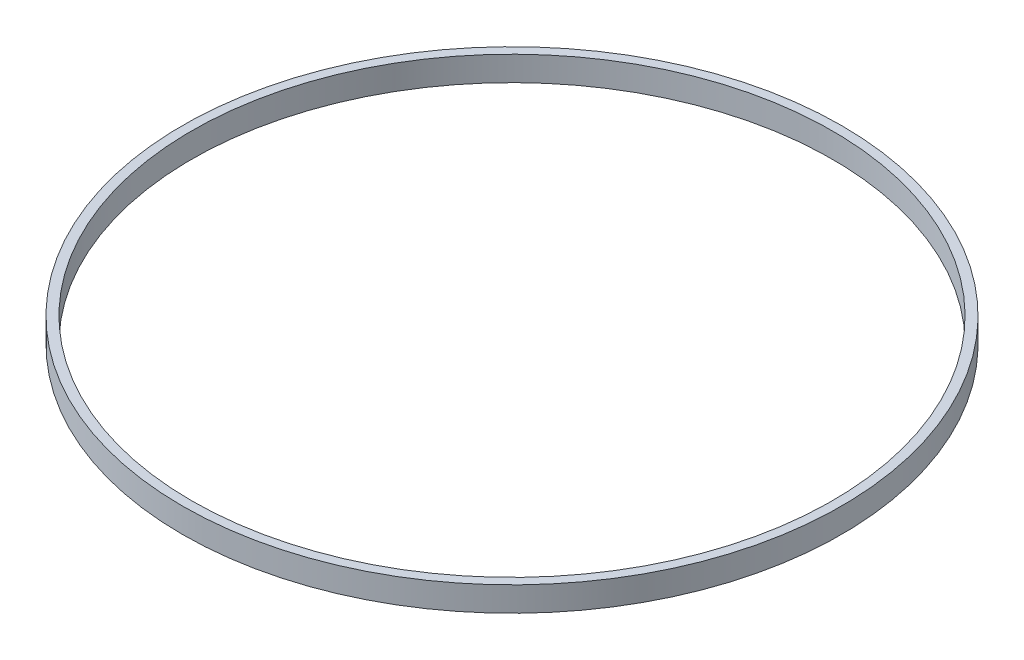
ISO-10303-21;
HEADER;
FILE_DESCRIPTION(('STEP AP214'),'2;1');
FILE_NAME('part.step','',(''),(''),'','','');
FILE_SCHEMA(('AUTOMOTIVE_DESIGN { 1 0 10303 214 1 1 1 1 }'));
ENDSEC;
DATA;
#1=APPLICATION_CONTEXT('core data for automotive mechanical design processes');
#2=APPLICATION_PROTOCOL_DEFINITION('international standard','automotive_design',2000,#1);
#3=PRODUCT_CONTEXT('',#1,'mechanical');
#4=PRODUCT('Part','Part','',(#3));
#5=PRODUCT_RELATED_PRODUCT_CATEGORY('part','',(#4));
#6=PRODUCT_DEFINITION_FORMATION('','',#4);
#7=PRODUCT_DEFINITION_CONTEXT('part definition',#1,'design');
#8=PRODUCT_DEFINITION('design','',#6,#7);
#9=PRODUCT_DEFINITION_SHAPE('','',#8);
#10=(LENGTH_UNIT() NAMED_UNIT(*) SI_UNIT(.MILLI.,.METRE.));
#11=(NAMED_UNIT(*) PLANE_ANGLE_UNIT() SI_UNIT($,.RADIAN.));
#12=(NAMED_UNIT(*) SI_UNIT($,.STERADIAN.) SOLID_ANGLE_UNIT());
#13=UNCERTAINTY_MEASURE_WITH_UNIT(LENGTH_MEASURE(1.E-05),#10,'distance_accuracy_value','');
#14=(GEOMETRIC_REPRESENTATION_CONTEXT(3) GLOBAL_UNCERTAINTY_ASSIGNED_CONTEXT((#13)) GLOBAL_UNIT_ASSIGNED_CONTEXT((#10,
#11,#12)) REPRESENTATION_CONTEXT('',''));
#15=CARTESIAN_POINT('',(0.,0.,0.));
#16=DIRECTION('',(0.,0.,1.));
#17=DIRECTION('',(1.,0.,0.));
#18=AXIS2_PLACEMENT_3D('',#15,#16,#17);
#19=CARTESIAN_POINT('',(0.,0.,0.));
#20=DIRECTION('',(0.,1.,0.));
#21=DIRECTION('',(0.,0.,1.));
#22=AXIS2_PLACEMENT_3D('',#19,#20,#21);
#23=CYLINDRICAL_SURFACE('',#22,58.2);
#24=CARTESIAN_POINT('',(0.,0.204397726707293,0.));
#25=DIRECTION('',(0.,1.,0.));
#26=DIRECTION('',(0.,0.,1.));
#27=AXIS2_PLACEMENT_3D('',#24,#25,#26);
#28=CIRCLE('',#27,58.2);
#29=CARTESIAN_POINT('',(0.,0.204397726707293,58.2));
#30=VERTEX_POINT('',#29);
#31=EDGE_CURVE('E10',#30,#30,#28,.T.);
#32=ORIENTED_EDGE('',*,*,#31,.T.);
#33=EDGE_LOOP('',(#32));
#34=FACE_BOUND('',#33,.T.);
#35=CARTESIAN_POINT('',(0.,4.55439772670729,0.));
#36=DIRECTION('',(0.,1.,0.));
#37=DIRECTION('',(0.,0.,1.));
#38=AXIS2_PLACEMENT_3D('',#35,#36,#37);
#39=CIRCLE('',#38,58.2);
#40=CARTESIAN_POINT('',(0.,4.55439772670729,58.2));
#41=VERTEX_POINT('',#40);
#42=EDGE_CURVE('E47',#41,#41,#39,.T.);
#43=ORIENTED_EDGE('',*,*,#42,.F.);
#44=EDGE_LOOP('',(#43));
#45=FACE_BOUND('',#44,.T.);
#46=ADVANCED_FACE('F33',(#34,#45),#23,.T.);
#47=CARTESIAN_POINT('',(58.2,0.204397726707293,0.));
#48=DIRECTION('',(0.,-1.,0.));
#49=DIRECTION('',(0.,0.,-1.));
#50=AXIS2_PLACEMENT_3D('',#47,#48,#49);
#51=PLANE('',#50);
#52=CARTESIAN_POINT('',(0.,0.204397726707293,0.));
#53=DIRECTION('',(0.,1.,0.));
#54=DIRECTION('',(0.,0.,1.));
#55=AXIS2_PLACEMENT_3D('',#52,#53,#54);
#56=CIRCLE('',#55,56.58);
#57=CARTESIAN_POINT('',(0.,0.204397726707293,56.58));
#58=VERTEX_POINT('',#57);
#59=EDGE_CURVE('E39',#58,#58,#56,.T.);
#60=ORIENTED_EDGE('',*,*,#59,.T.);
#61=EDGE_LOOP('',(#60));
#62=FACE_BOUND('',#61,.T.);
#63=ORIENTED_EDGE('',*,*,#31,.F.);
#64=EDGE_LOOP('',(#63));
#65=FACE_BOUND('',#64,.T.);
#66=ADVANCED_FACE('F57',(#62,#65),#51,.T.);
#67=CARTESIAN_POINT('',(0.,0.,0.));
#68=DIRECTION('',(0.,1.,0.));
#69=DIRECTION('',(0.,0.,1.));
#70=AXIS2_PLACEMENT_3D('',#67,#68,#69);
#71=CYLINDRICAL_SURFACE('',#70,56.58);
#72=CARTESIAN_POINT('',(0.,4.55439772670729,0.));
#73=DIRECTION('',(0.,1.,0.));
#74=DIRECTION('',(0.,0.,1.));
#75=AXIS2_PLACEMENT_3D('',#72,#73,#74);
#76=CIRCLE('',#75,56.58);
#77=CARTESIAN_POINT('',(0.,4.55439772670729,56.58));
#78=VERTEX_POINT('',#77);
#79=EDGE_CURVE('E43',#78,#78,#76,.T.);
#80=ORIENTED_EDGE('',*,*,#79,.T.);
#81=EDGE_LOOP('',(#80));
#82=FACE_BOUND('',#81,.T.);
#83=ORIENTED_EDGE('',*,*,#59,.F.);
#84=EDGE_LOOP('',(#83));
#85=FACE_BOUND('',#84,.T.);
#86=ADVANCED_FACE('F61',(#82,#85),#71,.F.);
#87=CARTESIAN_POINT('',(56.58,4.55439772670729,0.));
#88=DIRECTION('',(0.,1.,0.));
#89=DIRECTION('',(0.,0.,1.));
#90=AXIS2_PLACEMENT_3D('',#87,#88,#89);
#91=PLANE('',#90);
#92=ORIENTED_EDGE('',*,*,#42,.T.);
#93=EDGE_LOOP('',(#92));
#94=FACE_BOUND('',#93,.T.);
#95=ORIENTED_EDGE('',*,*,#79,.F.);
#96=EDGE_LOOP('',(#95));
#97=FACE_BOUND('',#96,.T.);
#98=ADVANCED_FACE('F53',(#94,#97),#91,.T.);
#99=CLOSED_SHELL('',(#46,#66,#86,#98));
#100=MANIFOLD_SOLID_BREP('B2',#99);
#101=ADVANCED_BREP_SHAPE_REPRESENTATION('',(#18,#100),#14);
#102=SHAPE_DEFINITION_REPRESENTATION(#9,#101);
ENDSEC;
END-ISO-10303-21;
